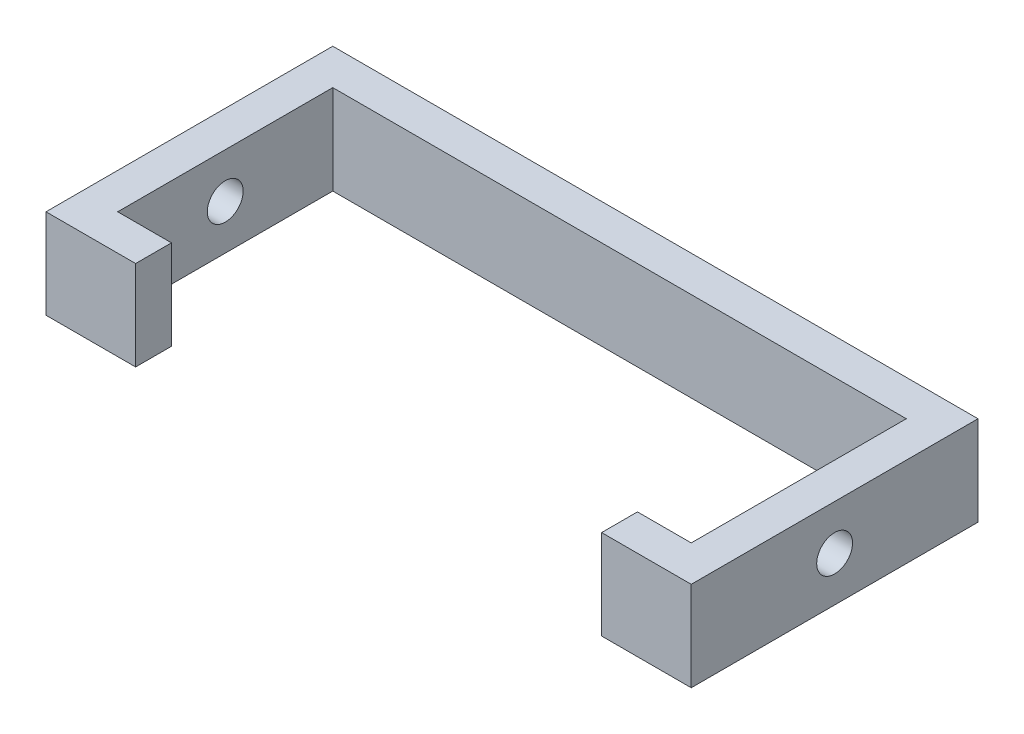
ISO-10303-21;
HEADER;
FILE_DESCRIPTION(('STEP AP214'),'2;1');
FILE_NAME('part.step','',(''),(''),'','','');
FILE_SCHEMA(('AUTOMOTIVE_DESIGN { 1 0 10303 214 1 1 1 1 }'));
ENDSEC;
DATA;
#1=APPLICATION_CONTEXT('core data for automotive mechanical design processes');
#2=APPLICATION_PROTOCOL_DEFINITION('international standard','automotive_design',2000,#1);
#3=PRODUCT_CONTEXT('',#1,'mechanical');
#4=PRODUCT('Part','Part','',(#3));
#5=PRODUCT_RELATED_PRODUCT_CATEGORY('part','',(#4));
#6=PRODUCT_DEFINITION_FORMATION('','',#4);
#7=PRODUCT_DEFINITION_CONTEXT('part definition',#1,'design');
#8=PRODUCT_DEFINITION('design','',#6,#7);
#9=PRODUCT_DEFINITION_SHAPE('','',#8);
#10=(LENGTH_UNIT() NAMED_UNIT(*) SI_UNIT(.MILLI.,.METRE.));
#11=(NAMED_UNIT(*) PLANE_ANGLE_UNIT() SI_UNIT($,.RADIAN.));
#12=(NAMED_UNIT(*) SI_UNIT($,.STERADIAN.) SOLID_ANGLE_UNIT());
#13=UNCERTAINTY_MEASURE_WITH_UNIT(LENGTH_MEASURE(1.E-05),#10,'distance_accuracy_value','');
#14=(GEOMETRIC_REPRESENTATION_CONTEXT(3) GLOBAL_UNCERTAINTY_ASSIGNED_CONTEXT((#13)) GLOBAL_UNIT_ASSIGNED_CONTEXT((#10,
#11,#12)) REPRESENTATION_CONTEXT('',''));
#15=CARTESIAN_POINT('',(0.,0.,0.));
#16=DIRECTION('',(0.,0.,1.));
#17=DIRECTION('',(1.,0.,0.));
#18=AXIS2_PLACEMENT_3D('',#15,#16,#17);
#19=CARTESIAN_POINT('',(16.,2.5,6.));
#20=DIRECTION('',(0.,0.,1.));
#21=DIRECTION('',(1.,0.,0.));
#22=AXIS2_PLACEMENT_3D('',#19,#20,#21);
#23=PLANE('',#22);
#24=DIRECTION('',(-1.,0.,0.));
#25=VECTOR('',#24,1.);
#26=CARTESIAN_POINT('',(16.,-2.5,6.));
#27=LINE('',#26,#25);
#28=CARTESIAN_POINT('',(16.,-2.5,6.));
#29=VERTEX_POINT('',#28);
#30=CARTESIAN_POINT('',(13.,-2.5,6.));
#31=VERTEX_POINT('',#30);
#32=EDGE_CURVE('E154',#29,#31,#27,.T.);
#33=ORIENTED_EDGE('',*,*,#32,.T.);
#34=DIRECTION('',(0.,-1.,0.));
#35=VECTOR('',#34,1.);
#36=CARTESIAN_POINT('',(13.,2.5,6.));
#37=LINE('',#36,#35);
#38=CARTESIAN_POINT('',(13.,2.5,6.));
#39=VERTEX_POINT('',#38);
#40=EDGE_CURVE('E11',#39,#31,#37,.T.);
#41=ORIENTED_EDGE('',*,*,#40,.F.);
#42=DIRECTION('',(-1.,0.,0.));
#43=VECTOR('',#42,1.);
#44=CARTESIAN_POINT('',(16.,2.5,6.));
#45=LINE('',#44,#43);
#46=CARTESIAN_POINT('',(16.,2.5,6.));
#47=VERTEX_POINT('',#46);
#48=EDGE_CURVE('E177',#47,#39,#45,.T.);
#49=ORIENTED_EDGE('',*,*,#48,.F.);
#50=DIRECTION('',(0.,-1.,0.));
#51=VECTOR('',#50,1.);
#52=CARTESIAN_POINT('',(16.,2.5,6.));
#53=LINE('',#52,#51);
#54=EDGE_CURVE('E150',#47,#29,#53,.T.);
#55=ORIENTED_EDGE('',*,*,#54,.T.);
#56=EDGE_LOOP('',(#33,#41,#49,#55));
#57=FACE_BOUND('',#56,.T.);
#58=ADVANCED_FACE('F33',(#57),#23,.F.);
#59=CARTESIAN_POINT('',(13.,2.5,6.));
#60=DIRECTION('',(1.,0.,0.));
#61=DIRECTION('',(0.,0.,-1.));
#62=AXIS2_PLACEMENT_3D('',#59,#60,#61);
#63=PLANE('',#62);
#64=DIRECTION('',(0.,0.,1.));
#65=VECTOR('',#64,1.);
#66=CARTESIAN_POINT('',(13.,-2.5,6.));
#67=LINE('',#66,#65);
#68=CARTESIAN_POINT('',(13.,-2.5,8.));
#69=VERTEX_POINT('',#68);
#70=EDGE_CURVE('E157',#31,#69,#67,.T.);
#71=ORIENTED_EDGE('',*,*,#70,.T.);
#72=DIRECTION('',(0.,-1.,0.));
#73=VECTOR('',#72,1.);
#74=CARTESIAN_POINT('',(13.,2.5,8.));
#75=LINE('',#74,#73);
#76=CARTESIAN_POINT('',(13.,2.5,8.));
#77=VERTEX_POINT('',#76);
#78=EDGE_CURVE('E42',#77,#69,#75,.T.);
#79=ORIENTED_EDGE('',*,*,#78,.F.);
#80=DIRECTION('',(0.,0.,1.));
#81=VECTOR('',#80,1.);
#82=CARTESIAN_POINT('',(13.,2.5,6.));
#83=LINE('',#82,#81);
#84=EDGE_CURVE('E105',#39,#77,#83,.T.);
#85=ORIENTED_EDGE('',*,*,#84,.F.);
#86=ORIENTED_EDGE('',*,*,#40,.T.);
#87=EDGE_LOOP('',(#71,#79,#85,#86));
#88=FACE_BOUND('',#87,.T.);
#89=ADVANCED_FACE('F258',(#88),#63,.F.);
#90=CARTESIAN_POINT('',(18.,2.5,8.));
#91=DIRECTION('',(0.,0.,-1.));
#92=DIRECTION('',(-1.,0.,0.));
#93=AXIS2_PLACEMENT_3D('',#90,#91,#92);
#94=PLANE('',#93);
#95=DIRECTION('',(1.,0.,0.));
#96=VECTOR('',#95,1.);
#97=CARTESIAN_POINT('',(18.,-2.5,8.));
#98=LINE('',#97,#96);
#99=CARTESIAN_POINT('',(18.,-2.5,8.));
#100=VERTEX_POINT('',#99);
#101=EDGE_CURVE('E160',#69,#100,#98,.T.);
#102=ORIENTED_EDGE('',*,*,#101,.T.);
#103=DIRECTION('',(0.,-1.,0.));
#104=VECTOR('',#103,1.);
#105=CARTESIAN_POINT('',(18.,2.5,8.));
#106=LINE('',#105,#104);
#107=CARTESIAN_POINT('',(18.,2.5,8.));
#108=VERTEX_POINT('',#107);
#109=EDGE_CURVE('E196',#108,#100,#106,.T.);
#110=ORIENTED_EDGE('',*,*,#109,.F.);
#111=DIRECTION('',(1.,0.,0.));
#112=VECTOR('',#111,1.);
#113=CARTESIAN_POINT('',(18.,2.5,8.));
#114=LINE('',#113,#112);
#115=EDGE_CURVE('E205',#77,#108,#114,.T.);
#116=ORIENTED_EDGE('',*,*,#115,.F.);
#117=ORIENTED_EDGE('',*,*,#78,.T.);
#118=EDGE_LOOP('',(#102,#110,#116,#117));
#119=FACE_BOUND('',#118,.T.);
#120=ADVANCED_FACE('F203',(#119),#94,.F.);
#121=CARTESIAN_POINT('',(18.,2.5,-8.));
#122=DIRECTION('',(-1.,0.,0.));
#123=DIRECTION('',(0.,0.,1.));
#124=AXIS2_PLACEMENT_3D('',#121,#122,#123);
#125=PLANE('',#124);
#126=CARTESIAN_POINT('',(18.,0.,0.));
#127=DIRECTION('',(-1.,0.,0.));
#128=DIRECTION('',(0.,0.,1.));
#129=AXIS2_PLACEMENT_3D('',#126,#127,#128);
#130=CIRCLE('',#129,1.);
#131=CARTESIAN_POINT('',(18.,0.,0.999999999999992));
#132=VERTEX_POINT('',#131);
#133=EDGE_CURVE('E158',#132,#132,#130,.T.);
#134=ORIENTED_EDGE('',*,*,#133,.T.);
#135=EDGE_LOOP('',(#134));
#136=FACE_BOUND('',#135,.T.);
#137=DIRECTION('',(0.,0.,-1.));
#138=VECTOR('',#137,1.);
#139=CARTESIAN_POINT('',(18.,-2.5,-8.));
#140=LINE('',#139,#138);
#141=CARTESIAN_POINT('',(18.,-2.5,-8.));
#142=VERTEX_POINT('',#141);
#143=EDGE_CURVE('E162',#100,#142,#140,.T.);
#144=ORIENTED_EDGE('',*,*,#143,.T.);
#145=DIRECTION('',(0.,-1.,0.));
#146=VECTOR('',#145,1.);
#147=CARTESIAN_POINT('',(18.,2.5,-8.));
#148=LINE('',#147,#146);
#149=CARTESIAN_POINT('',(18.,2.5,-8.));
#150=VERTEX_POINT('',#149);
#151=EDGE_CURVE('E193',#150,#142,#148,.T.);
#152=ORIENTED_EDGE('',*,*,#151,.F.);
#153=DIRECTION('',(0.,0.,-1.));
#154=VECTOR('',#153,1.);
#155=CARTESIAN_POINT('',(18.,2.5,-8.));
#156=LINE('',#155,#154);
#157=EDGE_CURVE('E223',#108,#150,#156,.T.);
#158=ORIENTED_EDGE('',*,*,#157,.F.);
#159=ORIENTED_EDGE('',*,*,#109,.T.);
#160=EDGE_LOOP('',(#144,#152,#158,#159));
#161=FACE_BOUND('',#160,.T.);
#162=ADVANCED_FACE('F214',(#136,#161),#125,.F.);
#163=CARTESIAN_POINT('',(-18.,2.5,-8.));
#164=DIRECTION('',(0.,0.,1.));
#165=DIRECTION('',(1.,0.,0.));
#166=AXIS2_PLACEMENT_3D('',#163,#164,#165);
#167=PLANE('',#166);
#168=DIRECTION('',(-1.,0.,0.));
#169=VECTOR('',#168,1.);
#170=CARTESIAN_POINT('',(-18.,-2.5,-8.));
#171=LINE('',#170,#169);
#172=CARTESIAN_POINT('',(-18.,-2.5,-8.));
#173=VERTEX_POINT('',#172);
#174=EDGE_CURVE('E164',#142,#173,#171,.T.);
#175=ORIENTED_EDGE('',*,*,#174,.T.);
#176=DIRECTION('',(0.,-1.,0.));
#177=VECTOR('',#176,1.);
#178=CARTESIAN_POINT('',(-18.,2.5,-8.));
#179=LINE('',#178,#177);
#180=CARTESIAN_POINT('',(-18.,2.5,-8.));
#181=VERTEX_POINT('',#180);
#182=EDGE_CURVE('E190',#181,#173,#179,.T.);
#183=ORIENTED_EDGE('',*,*,#182,.F.);
#184=DIRECTION('',(-1.,0.,0.));
#185=VECTOR('',#184,1.);
#186=CARTESIAN_POINT('',(-18.,2.5,-8.));
#187=LINE('',#186,#185);
#188=EDGE_CURVE('E220',#150,#181,#187,.T.);
#189=ORIENTED_EDGE('',*,*,#188,.F.);
#190=ORIENTED_EDGE('',*,*,#151,.T.);
#191=EDGE_LOOP('',(#175,#183,#189,#190));
#192=FACE_BOUND('',#191,.T.);
#193=ADVANCED_FACE('F218',(#192),#167,.F.);
#194=CARTESIAN_POINT('',(-18.,2.5,-8.));
#195=DIRECTION('',(1.,0.,0.));
#196=DIRECTION('',(0.,0.,-1.));
#197=AXIS2_PLACEMENT_3D('',#194,#195,#196);
#198=PLANE('',#197);
#199=CARTESIAN_POINT('',(-18.,0.,0.));
#200=DIRECTION('',(1.,0.,0.));
#201=DIRECTION('',(0.,0.,-1.));
#202=AXIS2_PLACEMENT_3D('',#199,#200,#201);
#203=CIRCLE('',#202,1.);
#204=CARTESIAN_POINT('',(-18.,0.,-0.999999999999992));
#205=VERTEX_POINT('',#204);
#206=EDGE_CURVE('E295',#205,#205,#203,.T.);
#207=ORIENTED_EDGE('',*,*,#206,.T.);
#208=EDGE_LOOP('',(#207));
#209=FACE_BOUND('',#208,.T.);
#210=DIRECTION('',(0.,0.,1.));
#211=VECTOR('',#210,1.);
#212=CARTESIAN_POINT('',(-18.,-2.5,-8.));
#213=LINE('',#212,#211);
#214=CARTESIAN_POINT('',(-18.,-2.5,8.));
#215=VERTEX_POINT('',#214);
#216=EDGE_CURVE('E166',#173,#215,#213,.T.);
#217=ORIENTED_EDGE('',*,*,#216,.T.);
#218=DIRECTION('',(0.,-1.,0.));
#219=VECTOR('',#218,1.);
#220=CARTESIAN_POINT('',(-18.,2.5,8.));
#221=LINE('',#220,#219);
#222=CARTESIAN_POINT('',(-18.,2.5,8.));
#223=VERTEX_POINT('',#222);
#224=EDGE_CURVE('E187',#223,#215,#221,.T.);
#225=ORIENTED_EDGE('',*,*,#224,.F.);
#226=DIRECTION('',(0.,0.,1.));
#227=VECTOR('',#226,1.);
#228=CARTESIAN_POINT('',(-18.,2.5,-8.));
#229=LINE('',#228,#227);
#230=EDGE_CURVE('E222',#181,#223,#229,.T.);
#231=ORIENTED_EDGE('',*,*,#230,.F.);
#232=ORIENTED_EDGE('',*,*,#182,.T.);
#233=EDGE_LOOP('',(#217,#225,#231,#232));
#234=FACE_BOUND('',#233,.T.);
#235=ADVANCED_FACE('F272',(#209,#234),#198,.F.);
#236=CARTESIAN_POINT('',(-13.,2.5,8.));
#237=DIRECTION('',(0.,0.,-1.));
#238=DIRECTION('',(-1.,0.,0.));
#239=AXIS2_PLACEMENT_3D('',#236,#237,#238);
#240=PLANE('',#239);
#241=DIRECTION('',(1.,0.,0.));
#242=VECTOR('',#241,1.);
#243=CARTESIAN_POINT('',(-13.,-2.5,8.));
#244=LINE('',#243,#242);
#245=CARTESIAN_POINT('',(-13.,-2.5,8.));
#246=VERTEX_POINT('',#245);
#247=EDGE_CURVE('E168',#215,#246,#244,.T.);
#248=ORIENTED_EDGE('',*,*,#247,.T.);
#249=DIRECTION('',(0.,-1.,0.));
#250=VECTOR('',#249,1.);
#251=CARTESIAN_POINT('',(-13.,2.5,8.));
#252=LINE('',#251,#250);
#253=CARTESIAN_POINT('',(-13.,2.5,8.));
#254=VERTEX_POINT('',#253);
#255=EDGE_CURVE('E184',#254,#246,#252,.T.);
#256=ORIENTED_EDGE('',*,*,#255,.F.);
#257=DIRECTION('',(1.,0.,0.));
#258=VECTOR('',#257,1.);
#259=CARTESIAN_POINT('',(-13.,2.5,8.));
#260=LINE('',#259,#258);
#261=EDGE_CURVE('E225',#223,#254,#260,.T.);
#262=ORIENTED_EDGE('',*,*,#261,.F.);
#263=ORIENTED_EDGE('',*,*,#224,.T.);
#264=EDGE_LOOP('',(#248,#256,#262,#263));
#265=FACE_BOUND('',#264,.T.);
#266=ADVANCED_FACE('F275',(#265),#240,.F.);
#267=CARTESIAN_POINT('',(-13.,2.5,6.));
#268=DIRECTION('',(-1.,0.,0.));
#269=DIRECTION('',(0.,0.,1.));
#270=AXIS2_PLACEMENT_3D('',#267,#268,#269);
#271=PLANE('',#270);
#272=DIRECTION('',(0.,0.,-1.));
#273=VECTOR('',#272,1.);
#274=CARTESIAN_POINT('',(-13.,-2.5,6.));
#275=LINE('',#274,#273);
#276=CARTESIAN_POINT('',(-13.,-2.5,6.));
#277=VERTEX_POINT('',#276);
#278=EDGE_CURVE('E170',#246,#277,#275,.T.);
#279=ORIENTED_EDGE('',*,*,#278,.T.);
#280=DIRECTION('',(0.,-1.,0.));
#281=VECTOR('',#280,1.);
#282=CARTESIAN_POINT('',(-13.,2.5,6.));
#283=LINE('',#282,#281);
#284=CARTESIAN_POINT('',(-13.,2.5,6.));
#285=VERTEX_POINT('',#284);
#286=EDGE_CURVE('E181',#285,#277,#283,.T.);
#287=ORIENTED_EDGE('',*,*,#286,.F.);
#288=DIRECTION('',(0.,0.,-1.));
#289=VECTOR('',#288,1.);
#290=CARTESIAN_POINT('',(-13.,2.5,6.));
#291=LINE('',#290,#289);
#292=EDGE_CURVE('E231',#254,#285,#291,.T.);
#293=ORIENTED_EDGE('',*,*,#292,.F.);
#294=ORIENTED_EDGE('',*,*,#255,.T.);
#295=EDGE_LOOP('',(#279,#287,#293,#294));
#296=FACE_BOUND('',#295,.T.);
#297=ADVANCED_FACE('F237',(#296),#271,.F.);
#298=CARTESIAN_POINT('',(-16.,2.5,6.));
#299=DIRECTION('',(0.,0.,1.));
#300=DIRECTION('',(1.,0.,0.));
#301=AXIS2_PLACEMENT_3D('',#298,#299,#300);
#302=PLANE('',#301);
#303=DIRECTION('',(-1.,0.,0.));
#304=VECTOR('',#303,1.);
#305=CARTESIAN_POINT('',(-16.,-2.5,6.));
#306=LINE('',#305,#304);
#307=CARTESIAN_POINT('',(-16.,-2.5,6.));
#308=VERTEX_POINT('',#307);
#309=EDGE_CURVE('E172',#277,#308,#306,.T.);
#310=ORIENTED_EDGE('',*,*,#309,.T.);
#311=DIRECTION('',(0.,-1.,0.));
#312=VECTOR('',#311,1.);
#313=CARTESIAN_POINT('',(-16.,2.5,6.));
#314=LINE('',#313,#312);
#315=CARTESIAN_POINT('',(-16.,2.5,6.));
#316=VERTEX_POINT('',#315);
#317=EDGE_CURVE('E145',#316,#308,#314,.T.);
#318=ORIENTED_EDGE('',*,*,#317,.F.);
#319=DIRECTION('',(-1.,0.,0.));
#320=VECTOR('',#319,1.);
#321=CARTESIAN_POINT('',(-16.,2.5,6.));
#322=LINE('',#321,#320);
#323=EDGE_CURVE('E136',#285,#316,#322,.T.);
#324=ORIENTED_EDGE('',*,*,#323,.F.);
#325=ORIENTED_EDGE('',*,*,#286,.T.);
#326=EDGE_LOOP('',(#310,#318,#324,#325));
#327=FACE_BOUND('',#326,.T.);
#328=ADVANCED_FACE('F241',(#327),#302,.F.);
#329=CARTESIAN_POINT('',(-16.,2.5,-6.));
#330=DIRECTION('',(-1.,0.,0.));
#331=DIRECTION('',(0.,0.,1.));
#332=AXIS2_PLACEMENT_3D('',#329,#330,#331);
#333=PLANE('',#332);
#334=CARTESIAN_POINT('',(-16.,0.,0.));
#335=DIRECTION('',(-1.,0.,0.));
#336=DIRECTION('',(0.,0.,1.));
#337=AXIS2_PLACEMENT_3D('',#334,#335,#336);
#338=CIRCLE('',#337,1.);
#339=CARTESIAN_POINT('',(-16.,0.,1.00000000000001));
#340=VERTEX_POINT('',#339);
#341=EDGE_CURVE('E290',#340,#340,#338,.T.);
#342=ORIENTED_EDGE('',*,*,#341,.T.);
#343=EDGE_LOOP('',(#342));
#344=FACE_BOUND('',#343,.T.);
#345=DIRECTION('',(0.,0.,-1.));
#346=VECTOR('',#345,1.);
#347=CARTESIAN_POINT('',(-16.,-2.5,-6.));
#348=LINE('',#347,#346);
#349=CARTESIAN_POINT('',(-16.,-2.5,-6.));
#350=VERTEX_POINT('',#349);
#351=EDGE_CURVE('E144',#308,#350,#348,.T.);
#352=ORIENTED_EDGE('',*,*,#351,.T.);
#353=DIRECTION('',(0.,-1.,0.));
#354=VECTOR('',#353,1.);
#355=CARTESIAN_POINT('',(-16.,2.5,-6.));
#356=LINE('',#355,#354);
#357=CARTESIAN_POINT('',(-16.,2.5,-6.));
#358=VERTEX_POINT('',#357);
#359=EDGE_CURVE('E141',#358,#350,#356,.T.);
#360=ORIENTED_EDGE('',*,*,#359,.F.);
#361=DIRECTION('',(0.,0.,-1.));
#362=VECTOR('',#361,1.);
#363=CARTESIAN_POINT('',(-16.,2.5,-6.));
#364=LINE('',#363,#362);
#365=EDGE_CURVE('E130',#316,#358,#364,.T.);
#366=ORIENTED_EDGE('',*,*,#365,.F.);
#367=ORIENTED_EDGE('',*,*,#317,.T.);
#368=EDGE_LOOP('',(#352,#360,#366,#367));
#369=FACE_BOUND('',#368,.T.);
#370=ADVANCED_FACE('F142',(#344,#369),#333,.F.);
#371=CARTESIAN_POINT('',(-16.,2.5,-6.));
#372=DIRECTION('',(0.,0.,-1.));
#373=DIRECTION('',(-1.,0.,0.));
#374=AXIS2_PLACEMENT_3D('',#371,#372,#373);
#375=PLANE('',#374);
#376=DIRECTION('',(1.,0.,0.));
#377=VECTOR('',#376,1.);
#378=CARTESIAN_POINT('',(-16.,-2.5,-6.));
#379=LINE('',#378,#377);
#380=CARTESIAN_POINT('',(16.,-2.5,-6.));
#381=VERTEX_POINT('',#380);
#382=EDGE_CURVE('E91',#350,#381,#379,.T.);
#383=ORIENTED_EDGE('',*,*,#382,.T.);
#384=DIRECTION('',(0.,-1.,0.));
#385=VECTOR('',#384,1.);
#386=CARTESIAN_POINT('',(16.,2.5,-6.));
#387=LINE('',#386,#385);
#388=CARTESIAN_POINT('',(16.,2.5,-6.));
#389=VERTEX_POINT('',#388);
#390=EDGE_CURVE('E146',#389,#381,#387,.T.);
#391=ORIENTED_EDGE('',*,*,#390,.F.);
#392=DIRECTION('',(1.,0.,0.));
#393=VECTOR('',#392,1.);
#394=CARTESIAN_POINT('',(-16.,2.5,-6.));
#395=LINE('',#394,#393);
#396=EDGE_CURVE('E134',#358,#389,#395,.T.);
#397=ORIENTED_EDGE('',*,*,#396,.F.);
#398=ORIENTED_EDGE('',*,*,#359,.T.);
#399=EDGE_LOOP('',(#383,#391,#397,#398));
#400=FACE_BOUND('',#399,.T.);
#401=ADVANCED_FACE('F148',(#400),#375,.F.);
#402=CARTESIAN_POINT('',(16.,2.5,-6.));
#403=DIRECTION('',(1.,0.,0.));
#404=DIRECTION('',(0.,0.,-1.));
#405=AXIS2_PLACEMENT_3D('',#402,#403,#404);
#406=PLANE('',#405);
#407=CARTESIAN_POINT('',(16.,0.,0.));
#408=DIRECTION('',(1.,0.,0.));
#409=DIRECTION('',(0.,0.,-1.));
#410=AXIS2_PLACEMENT_3D('',#407,#408,#409);
#411=CIRCLE('',#410,1.);
#412=CARTESIAN_POINT('',(16.,0.,-1.00000000000001));
#413=VERTEX_POINT('',#412);
#414=EDGE_CURVE('E36',#413,#413,#411,.T.);
#415=ORIENTED_EDGE('',*,*,#414,.T.);
#416=EDGE_LOOP('',(#415));
#417=FACE_BOUND('',#416,.T.);
#418=DIRECTION('',(0.,0.,1.));
#419=VECTOR('',#418,1.);
#420=CARTESIAN_POINT('',(16.,-2.5,-6.));
#421=LINE('',#420,#419);
#422=EDGE_CURVE('E97',#381,#29,#421,.T.);
#423=ORIENTED_EDGE('',*,*,#422,.T.);
#424=ORIENTED_EDGE('',*,*,#54,.F.);
#425=DIRECTION('',(0.,0.,1.));
#426=VECTOR('',#425,1.);
#427=CARTESIAN_POINT('',(16.,2.5,-6.));
#428=LINE('',#427,#426);
#429=EDGE_CURVE('E50',#389,#47,#428,.T.);
#430=ORIENTED_EDGE('',*,*,#429,.F.);
#431=ORIENTED_EDGE('',*,*,#390,.T.);
#432=EDGE_LOOP('',(#423,#424,#430,#431));
#433=FACE_BOUND('',#432,.T.);
#434=ADVANCED_FACE('F245',(#417,#433),#406,.F.);
#435=CARTESIAN_POINT('',(0.,2.5,0.));
#436=DIRECTION('',(0.,1.,0.));
#437=DIRECTION('',(0.,0.,1.));
#438=AXIS2_PLACEMENT_3D('',#435,#436,#437);
#439=PLANE('',#438);
#440=ORIENTED_EDGE('',*,*,#48,.T.);
#441=ORIENTED_EDGE('',*,*,#84,.T.);
#442=ORIENTED_EDGE('',*,*,#115,.T.);
#443=ORIENTED_EDGE('',*,*,#157,.T.);
#444=ORIENTED_EDGE('',*,*,#188,.T.);
#445=ORIENTED_EDGE('',*,*,#230,.T.);
#446=ORIENTED_EDGE('',*,*,#261,.T.);
#447=ORIENTED_EDGE('',*,*,#292,.T.);
#448=ORIENTED_EDGE('',*,*,#323,.T.);
#449=ORIENTED_EDGE('',*,*,#365,.T.);
#450=ORIENTED_EDGE('',*,*,#396,.T.);
#451=ORIENTED_EDGE('',*,*,#429,.T.);
#452=EDGE_LOOP('',(#440,#441,#442,#443,#444,#445,#446,#447,#448,#449,#450,#451));
#453=FACE_BOUND('',#452,.T.);
#454=ADVANCED_FACE('F132',(#453),#439,.T.);
#455=CARTESIAN_POINT('',(0.,-2.5,0.));
#456=DIRECTION('',(0.,1.,0.));
#457=DIRECTION('',(0.,0.,1.));
#458=AXIS2_PLACEMENT_3D('',#455,#456,#457);
#459=PLANE('',#458);
#460=ORIENTED_EDGE('',*,*,#32,.F.);
#461=ORIENTED_EDGE('',*,*,#422,.F.);
#462=ORIENTED_EDGE('',*,*,#382,.F.);
#463=ORIENTED_EDGE('',*,*,#351,.F.);
#464=ORIENTED_EDGE('',*,*,#309,.F.);
#465=ORIENTED_EDGE('',*,*,#278,.F.);
#466=ORIENTED_EDGE('',*,*,#247,.F.);
#467=ORIENTED_EDGE('',*,*,#216,.F.);
#468=ORIENTED_EDGE('',*,*,#174,.F.);
#469=ORIENTED_EDGE('',*,*,#143,.F.);
#470=ORIENTED_EDGE('',*,*,#101,.F.);
#471=ORIENTED_EDGE('',*,*,#70,.F.);
#472=EDGE_LOOP('',(#460,#461,#462,#463,#464,#465,#466,#467,#468,#469,#470,#471));
#473=FACE_BOUND('',#472,.T.);
#474=ADVANCED_FACE('F209',(#473),#459,.F.);
#475=CARTESIAN_POINT('',(-18.,0.,0.));
#476=DIRECTION('',(1.,0.,0.));
#477=DIRECTION('',(0.,0.,-1.));
#478=AXIS2_PLACEMENT_3D('',#475,#476,#477);
#479=CYLINDRICAL_SURFACE('',#478,1.);
#480=ORIENTED_EDGE('',*,*,#414,.F.);
#481=EDGE_LOOP('',(#480));
#482=FACE_BOUND('',#481,.T.);
#483=ORIENTED_EDGE('',*,*,#133,.F.);
#484=EDGE_LOOP('',(#483));
#485=FACE_BOUND('',#484,.T.);
#486=ADVANCED_FACE('F305',(#482,#485),#479,.F.);
#487=ORIENTED_EDGE('',*,*,#206,.F.);
#488=EDGE_LOOP('',(#487));
#489=FACE_BOUND('',#488,.T.);
#490=ORIENTED_EDGE('',*,*,#341,.F.);
#491=EDGE_LOOP('',(#490));
#492=FACE_BOUND('',#491,.T.);
#493=ADVANCED_FACE('F303',(#489,#492),#479,.F.);
#494=CLOSED_SHELL('',(#58,#89,#120,#162,#193,#235,#266,#297,#328,#370,#401,#434,#454,#474,#486,#493));
#495=MANIFOLD_SOLID_BREP('B2',#494);
#496=ADVANCED_BREP_SHAPE_REPRESENTATION('',(#18,#495),#14);
#497=SHAPE_DEFINITION_REPRESENTATION(#9,#496);
ENDSEC;
END-ISO-10303-21;
